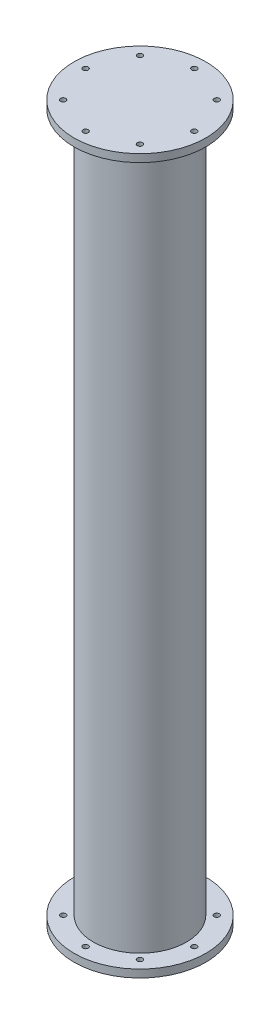
ISO-10303-21;
HEADER;
FILE_DESCRIPTION(('STEP AP214'),'2;1');
FILE_NAME('part.step','',(''),(''),'','','');
FILE_SCHEMA(('AUTOMOTIVE_DESIGN { 1 0 10303 214 1 1 1 1 }'));
ENDSEC;
DATA;
#1=APPLICATION_CONTEXT('core data for automotive mechanical design processes');
#2=APPLICATION_PROTOCOL_DEFINITION('international standard','automotive_design',2000,#1);
#3=PRODUCT_CONTEXT('',#1,'mechanical');
#4=PRODUCT('Part','Part','',(#3));
#5=PRODUCT_RELATED_PRODUCT_CATEGORY('part','',(#4));
#6=PRODUCT_DEFINITION_FORMATION('','',#4);
#7=PRODUCT_DEFINITION_CONTEXT('part definition',#1,'design');
#8=PRODUCT_DEFINITION('design','',#6,#7);
#9=PRODUCT_DEFINITION_SHAPE('','',#8);
#10=(LENGTH_UNIT() NAMED_UNIT(*) SI_UNIT(.MILLI.,.METRE.));
#11=(NAMED_UNIT(*) PLANE_ANGLE_UNIT() SI_UNIT($,.RADIAN.));
#12=(NAMED_UNIT(*) SI_UNIT($,.STERADIAN.) SOLID_ANGLE_UNIT());
#13=UNCERTAINTY_MEASURE_WITH_UNIT(LENGTH_MEASURE(1.E-05),#10,'distance_accuracy_value','');
#14=(GEOMETRIC_REPRESENTATION_CONTEXT(3) GLOBAL_UNCERTAINTY_ASSIGNED_CONTEXT((#13)) GLOBAL_UNIT_ASSIGNED_CONTEXT((#10,
#11,#12)) REPRESENTATION_CONTEXT('',''));
#15=CARTESIAN_POINT('',(0.,0.,0.));
#16=DIRECTION('',(0.,0.,1.));
#17=DIRECTION('',(1.,0.,0.));
#18=AXIS2_PLACEMENT_3D('',#15,#16,#17);
#19=CARTESIAN_POINT('',(0.,225.,0.));
#20=DIRECTION('',(0.,-1.,0.));
#21=DIRECTION('',(0.,0.,-1.));
#22=AXIS2_PLACEMENT_3D('',#19,#20,#21);
#23=CYLINDRICAL_SURFACE('',#22,30.);
#24=CARTESIAN_POINT('',(0.,225.,0.));
#25=DIRECTION('',(0.,1.,0.));
#26=DIRECTION('',(0.,0.,1.));
#27=AXIS2_PLACEMENT_3D('',#24,#25,#26);
#28=CIRCLE('',#27,30.);
#29=CARTESIAN_POINT('',(0.,225.,30.));
#30=VERTEX_POINT('',#29);
#31=EDGE_CURVE('E10',#30,#30,#28,.T.);
#32=ORIENTED_EDGE('',*,*,#31,.F.);
#33=EDGE_LOOP('',(#32));
#34=FACE_BOUND('',#33,.T.);
#35=CARTESIAN_POINT('',(0.,-225.,0.));
#36=DIRECTION('',(0.,1.,0.));
#37=DIRECTION('',(0.,0.,1.));
#38=AXIS2_PLACEMENT_3D('',#35,#36,#37);
#39=CIRCLE('',#38,30.);
#40=CARTESIAN_POINT('',(0.,-225.,30.));
#41=VERTEX_POINT('',#40);
#42=EDGE_CURVE('E35',#41,#41,#39,.T.);
#43=ORIENTED_EDGE('',*,*,#42,.T.);
#44=EDGE_LOOP('',(#43));
#45=FACE_BOUND('',#44,.T.);
#46=ADVANCED_FACE('F32',(#34,#45),#23,.T.);
#47=CARTESIAN_POINT('',(0.,230.,0.));
#48=DIRECTION('',(0.,-1.,0.));
#49=DIRECTION('',(0.,0.,-1.));
#50=AXIS2_PLACEMENT_3D('',#47,#48,#49);
#51=CYLINDRICAL_SURFACE('',#50,42.5);
#52=CARTESIAN_POINT('',(0.,230.,0.));
#53=DIRECTION('',(0.,1.,0.));
#54=DIRECTION('',(0.,0.,1.));
#55=AXIS2_PLACEMENT_3D('',#52,#53,#54);
#56=CIRCLE('',#55,42.5);
#57=CARTESIAN_POINT('',(0.,230.,42.5));
#58=VERTEX_POINT('',#57);
#59=EDGE_CURVE('E49',#58,#58,#56,.T.);
#60=ORIENTED_EDGE('',*,*,#59,.F.);
#61=EDGE_LOOP('',(#60));
#62=FACE_BOUND('',#61,.T.);
#63=CARTESIAN_POINT('',(0.,225.,0.));
#64=DIRECTION('',(0.,1.,0.));
#65=DIRECTION('',(0.,0.,1.));
#66=AXIS2_PLACEMENT_3D('',#63,#64,#65);
#67=CIRCLE('',#66,42.5);
#68=CARTESIAN_POINT('',(0.,225.,42.5));
#69=VERTEX_POINT('',#68);
#70=EDGE_CURVE('E50',#69,#69,#67,.T.);
#71=ORIENTED_EDGE('',*,*,#70,.T.);
#72=EDGE_LOOP('',(#71));
#73=FACE_BOUND('',#72,.T.);
#74=ADVANCED_FACE('F202',(#62,#73),#51,.T.);
#75=CARTESIAN_POINT('',(0.,230.,0.));
#76=DIRECTION('',(0.,1.,0.));
#77=DIRECTION('',(0.,0.,1.));
#78=AXIS2_PLACEMENT_3D('',#75,#76,#77);
#79=PLANE('',#78);
#80=CARTESIAN_POINT('',(24.7487373415292,230.,24.7487373415292));
#81=DIRECTION('',(0.,1.,0.));
#82=DIRECTION('',(0.,0.,1.));
#83=AXIS2_PLACEMENT_3D('',#80,#81,#82);
#84=CIRCLE('',#83,1.69999999999999);
#85=CARTESIAN_POINT('',(24.7487373415292,230.,26.4487373415292));
#86=VERTEX_POINT('',#85);
#87=EDGE_CURVE('E97',#86,#86,#84,.T.);
#88=ORIENTED_EDGE('',*,*,#87,.F.);
#89=EDGE_LOOP('',(#88));
#90=FACE_BOUND('',#89,.T.);
#91=CARTESIAN_POINT('',(35.,230.,0.));
#92=DIRECTION('',(0.,1.,0.));
#93=DIRECTION('',(0.,0.,1.));
#94=AXIS2_PLACEMENT_3D('',#91,#92,#93);
#95=CIRCLE('',#94,1.69999999999999);
#96=CARTESIAN_POINT('',(35.,230.,1.69999999999999));
#97=VERTEX_POINT('',#96);
#98=EDGE_CURVE('E91',#97,#97,#95,.T.);
#99=ORIENTED_EDGE('',*,*,#98,.F.);
#100=EDGE_LOOP('',(#99));
#101=FACE_BOUND('',#100,.T.);
#102=CARTESIAN_POINT('',(24.7487373415292,230.,-24.7487373415292));
#103=DIRECTION('',(0.,1.,0.));
#104=DIRECTION('',(0.,0.,1.));
#105=AXIS2_PLACEMENT_3D('',#102,#103,#104);
#106=CIRCLE('',#105,1.69999999999999);
#107=CARTESIAN_POINT('',(24.7487373415292,230.,-23.0487373415292));
#108=VERTEX_POINT('',#107);
#109=EDGE_CURVE('E85',#108,#108,#106,.T.);
#110=ORIENTED_EDGE('',*,*,#109,.F.);
#111=EDGE_LOOP('',(#110));
#112=FACE_BOUND('',#111,.T.);
#113=CARTESIAN_POINT('',(0.,230.,-35.));
#114=DIRECTION('',(0.,1.,0.));
#115=DIRECTION('',(0.,0.,1.));
#116=AXIS2_PLACEMENT_3D('',#113,#114,#115);
#117=CIRCLE('',#116,1.69999999999999);
#118=CARTESIAN_POINT('',(0.,230.,-33.3));
#119=VERTEX_POINT('',#118);
#120=EDGE_CURVE('E79',#119,#119,#117,.T.);
#121=ORIENTED_EDGE('',*,*,#120,.F.);
#122=EDGE_LOOP('',(#121));
#123=FACE_BOUND('',#122,.T.);
#124=CARTESIAN_POINT('',(-24.7487373415292,230.,-24.7487373415292));
#125=DIRECTION('',(0.,1.,0.));
#126=DIRECTION('',(0.,0.,1.));
#127=AXIS2_PLACEMENT_3D('',#124,#125,#126);
#128=CIRCLE('',#127,1.69999999999999);
#129=CARTESIAN_POINT('',(-24.7487373415292,230.,-23.0487373415292));
#130=VERTEX_POINT('',#129);
#131=EDGE_CURVE('E73',#130,#130,#128,.T.);
#132=ORIENTED_EDGE('',*,*,#131,.F.);
#133=EDGE_LOOP('',(#132));
#134=FACE_BOUND('',#133,.T.);
#135=CARTESIAN_POINT('',(-35.,230.,0.));
#136=DIRECTION('',(0.,1.,0.));
#137=DIRECTION('',(0.,0.,1.));
#138=AXIS2_PLACEMENT_3D('',#135,#136,#137);
#139=CIRCLE('',#138,1.69999999999999);
#140=CARTESIAN_POINT('',(-35.,230.,1.69999999999999));
#141=VERTEX_POINT('',#140);
#142=EDGE_CURVE('E67',#141,#141,#139,.T.);
#143=ORIENTED_EDGE('',*,*,#142,.F.);
#144=EDGE_LOOP('',(#143));
#145=FACE_BOUND('',#144,.T.);
#146=CARTESIAN_POINT('',(-24.7487373415292,230.,24.7487373415292));
#147=DIRECTION('',(0.,1.,0.));
#148=DIRECTION('',(0.,0.,1.));
#149=AXIS2_PLACEMENT_3D('',#146,#147,#148);
#150=CIRCLE('',#149,1.69999999999999);
#151=CARTESIAN_POINT('',(-24.7487373415292,230.,26.4487373415292));
#152=VERTEX_POINT('',#151);
#153=EDGE_CURVE('E61',#152,#152,#150,.T.);
#154=ORIENTED_EDGE('',*,*,#153,.F.);
#155=EDGE_LOOP('',(#154));
#156=FACE_BOUND('',#155,.T.);
#157=CARTESIAN_POINT('',(0.,230.,35.));
#158=DIRECTION('',(0.,1.,0.));
#159=DIRECTION('',(0.,0.,1.));
#160=AXIS2_PLACEMENT_3D('',#157,#158,#159);
#161=CIRCLE('',#160,1.69999999999999);
#162=CARTESIAN_POINT('',(0.,230.,36.7));
#163=VERTEX_POINT('',#162);
#164=EDGE_CURVE('E53',#163,#163,#161,.T.);
#165=ORIENTED_EDGE('',*,*,#164,.F.);
#166=EDGE_LOOP('',(#165));
#167=FACE_BOUND('',#166,.T.);
#168=ORIENTED_EDGE('',*,*,#59,.T.);
#169=EDGE_LOOP('',(#168));
#170=FACE_BOUND('',#169,.T.);
#171=ADVANCED_FACE('F207',(#90,#101,#112,#123,#134,#145,#156,#167,#170),#79,.T.);
#172=CARTESIAN_POINT('',(0.,225.,0.));
#173=DIRECTION('',(0.,1.,0.));
#174=DIRECTION('',(0.,0.,1.));
#175=AXIS2_PLACEMENT_3D('',#172,#173,#174);
#176=PLANE('',#175);
#177=CARTESIAN_POINT('',(24.7487373415292,225.,24.7487373415292));
#178=DIRECTION('',(0.,-1.,0.));
#179=DIRECTION('',(0.,0.,-1.));
#180=AXIS2_PLACEMENT_3D('',#177,#178,#179);
#181=CIRCLE('',#180,1.69999999999999);
#182=CARTESIAN_POINT('',(24.7487373415292,225.,23.0487373415292));
#183=VERTEX_POINT('',#182);
#184=EDGE_CURVE('E100',#183,#183,#181,.T.);
#185=ORIENTED_EDGE('',*,*,#184,.F.);
#186=EDGE_LOOP('',(#185));
#187=FACE_BOUND('',#186,.T.);
#188=CARTESIAN_POINT('',(35.,225.,0.));
#189=DIRECTION('',(0.,-1.,0.));
#190=DIRECTION('',(0.,0.,-1.));
#191=AXIS2_PLACEMENT_3D('',#188,#189,#190);
#192=CIRCLE('',#191,1.69999999999999);
#193=CARTESIAN_POINT('',(35.,225.,-1.69999999999998));
#194=VERTEX_POINT('',#193);
#195=EDGE_CURVE('E94',#194,#194,#192,.T.);
#196=ORIENTED_EDGE('',*,*,#195,.F.);
#197=EDGE_LOOP('',(#196));
#198=FACE_BOUND('',#197,.T.);
#199=CARTESIAN_POINT('',(24.7487373415292,225.,-24.7487373415292));
#200=DIRECTION('',(0.,-1.,0.));
#201=DIRECTION('',(0.,0.,-1.));
#202=AXIS2_PLACEMENT_3D('',#199,#200,#201);
#203=CIRCLE('',#202,1.69999999999999);
#204=CARTESIAN_POINT('',(24.7487373415292,225.,-26.4487373415292));
#205=VERTEX_POINT('',#204);
#206=EDGE_CURVE('E88',#205,#205,#203,.T.);
#207=ORIENTED_EDGE('',*,*,#206,.F.);
#208=EDGE_LOOP('',(#207));
#209=FACE_BOUND('',#208,.T.);
#210=CARTESIAN_POINT('',(0.,225.,-35.));
#211=DIRECTION('',(0.,-1.,0.));
#212=DIRECTION('',(0.,0.,-1.));
#213=AXIS2_PLACEMENT_3D('',#210,#211,#212);
#214=CIRCLE('',#213,1.69999999999999);
#215=CARTESIAN_POINT('',(0.,225.,-36.7));
#216=VERTEX_POINT('',#215);
#217=EDGE_CURVE('E82',#216,#216,#214,.T.);
#218=ORIENTED_EDGE('',*,*,#217,.F.);
#219=EDGE_LOOP('',(#218));
#220=FACE_BOUND('',#219,.T.);
#221=CARTESIAN_POINT('',(-24.7487373415292,225.,-24.7487373415292));
#222=DIRECTION('',(0.,-1.,0.));
#223=DIRECTION('',(0.,0.,-1.));
#224=AXIS2_PLACEMENT_3D('',#221,#222,#223);
#225=CIRCLE('',#224,1.69999999999999);
#226=CARTESIAN_POINT('',(-24.7487373415292,225.,-26.4487373415292));
#227=VERTEX_POINT('',#226);
#228=EDGE_CURVE('E76',#227,#227,#225,.T.);
#229=ORIENTED_EDGE('',*,*,#228,.F.);
#230=EDGE_LOOP('',(#229));
#231=FACE_BOUND('',#230,.T.);
#232=CARTESIAN_POINT('',(-35.,225.,0.));
#233=DIRECTION('',(0.,-1.,0.));
#234=DIRECTION('',(0.,0.,-1.));
#235=AXIS2_PLACEMENT_3D('',#232,#233,#234);
#236=CIRCLE('',#235,1.69999999999999);
#237=CARTESIAN_POINT('',(-35.,225.,-1.69999999999999));
#238=VERTEX_POINT('',#237);
#239=EDGE_CURVE('E70',#238,#238,#236,.T.);
#240=ORIENTED_EDGE('',*,*,#239,.F.);
#241=EDGE_LOOP('',(#240));
#242=FACE_BOUND('',#241,.T.);
#243=CARTESIAN_POINT('',(-24.7487373415292,225.,24.7487373415292));
#244=DIRECTION('',(0.,-1.,0.));
#245=DIRECTION('',(0.,0.,-1.));
#246=AXIS2_PLACEMENT_3D('',#243,#244,#245);
#247=CIRCLE('',#246,1.69999999999999);
#248=CARTESIAN_POINT('',(-24.7487373415292,225.,23.0487373415292));
#249=VERTEX_POINT('',#248);
#250=EDGE_CURVE('E64',#249,#249,#247,.T.);
#251=ORIENTED_EDGE('',*,*,#250,.F.);
#252=EDGE_LOOP('',(#251));
#253=FACE_BOUND('',#252,.T.);
#254=CARTESIAN_POINT('',(0.,225.,35.));
#255=DIRECTION('',(0.,-1.,0.));
#256=DIRECTION('',(0.,0.,-1.));
#257=AXIS2_PLACEMENT_3D('',#254,#255,#256);
#258=CIRCLE('',#257,1.69999999999999);
#259=CARTESIAN_POINT('',(0.,225.,33.3));
#260=VERTEX_POINT('',#259);
#261=EDGE_CURVE('E58',#260,#260,#258,.T.);
#262=ORIENTED_EDGE('',*,*,#261,.F.);
#263=EDGE_LOOP('',(#262));
#264=FACE_BOUND('',#263,.T.);
#265=ORIENTED_EDGE('',*,*,#31,.T.);
#266=EDGE_LOOP('',(#265));
#267=FACE_BOUND('',#266,.T.);
#268=ORIENTED_EDGE('',*,*,#70,.F.);
#269=EDGE_LOOP('',(#268));
#270=FACE_BOUND('',#269,.T.);
#271=ADVANCED_FACE('F214',(#187,#198,#209,#220,#231,#242,#253,#264,#267,#270),#176,.F.);
#272=CARTESIAN_POINT('',(0.,225.,35.));
#273=DIRECTION('',(0.,-1.,0.));
#274=DIRECTION('',(0.,0.,-1.));
#275=AXIS2_PLACEMENT_3D('',#272,#273,#274);
#276=CYLINDRICAL_SURFACE('',#275,1.69999999999999);
#277=ORIENTED_EDGE('',*,*,#261,.T.);
#278=EDGE_LOOP('',(#277));
#279=FACE_BOUND('',#278,.T.);
#280=ORIENTED_EDGE('',*,*,#164,.T.);
#281=EDGE_LOOP('',(#280));
#282=FACE_BOUND('',#281,.T.);
#283=ADVANCED_FACE('F370',(#279,#282),#276,.F.);
#284=CARTESIAN_POINT('',(-24.7487373415292,225.,24.7487373415292));
#285=DIRECTION('',(0.,-1.,0.));
#286=DIRECTION('',(0.,0.,-1.));
#287=AXIS2_PLACEMENT_3D('',#284,#285,#286);
#288=CYLINDRICAL_SURFACE('',#287,1.69999999999999);
#289=ORIENTED_EDGE('',*,*,#250,.T.);
#290=EDGE_LOOP('',(#289));
#291=FACE_BOUND('',#290,.T.);
#292=ORIENTED_EDGE('',*,*,#153,.T.);
#293=EDGE_LOOP('',(#292));
#294=FACE_BOUND('',#293,.T.);
#295=ADVANCED_FACE('F360',(#291,#294),#288,.F.);
#296=CARTESIAN_POINT('',(-35.,225.,0.));
#297=DIRECTION('',(0.,-1.,0.));
#298=DIRECTION('',(0.,0.,-1.));
#299=AXIS2_PLACEMENT_3D('',#296,#297,#298);
#300=CYLINDRICAL_SURFACE('',#299,1.69999999999999);
#301=ORIENTED_EDGE('',*,*,#239,.T.);
#302=EDGE_LOOP('',(#301));
#303=FACE_BOUND('',#302,.T.);
#304=ORIENTED_EDGE('',*,*,#142,.T.);
#305=EDGE_LOOP('',(#304));
#306=FACE_BOUND('',#305,.T.);
#307=ADVANCED_FACE('F350',(#303,#306),#300,.F.);
#308=CARTESIAN_POINT('',(-24.7487373415292,225.,-24.7487373415292));
#309=DIRECTION('',(0.,-1.,0.));
#310=DIRECTION('',(0.,0.,-1.));
#311=AXIS2_PLACEMENT_3D('',#308,#309,#310);
#312=CYLINDRICAL_SURFACE('',#311,1.69999999999999);
#313=ORIENTED_EDGE('',*,*,#228,.T.);
#314=EDGE_LOOP('',(#313));
#315=FACE_BOUND('',#314,.T.);
#316=ORIENTED_EDGE('',*,*,#131,.T.);
#317=EDGE_LOOP('',(#316));
#318=FACE_BOUND('',#317,.T.);
#319=ADVANCED_FACE('F340',(#315,#318),#312,.F.);
#320=CARTESIAN_POINT('',(0.,225.,-35.));
#321=DIRECTION('',(0.,-1.,0.));
#322=DIRECTION('',(0.,0.,-1.));
#323=AXIS2_PLACEMENT_3D('',#320,#321,#322);
#324=CYLINDRICAL_SURFACE('',#323,1.69999999999999);
#325=ORIENTED_EDGE('',*,*,#217,.T.);
#326=EDGE_LOOP('',(#325));
#327=FACE_BOUND('',#326,.T.);
#328=ORIENTED_EDGE('',*,*,#120,.T.);
#329=EDGE_LOOP('',(#328));
#330=FACE_BOUND('',#329,.T.);
#331=ADVANCED_FACE('F330',(#327,#330),#324,.F.);
#332=CARTESIAN_POINT('',(24.7487373415292,225.,-24.7487373415292));
#333=DIRECTION('',(0.,-1.,0.));
#334=DIRECTION('',(0.,0.,-1.));
#335=AXIS2_PLACEMENT_3D('',#332,#333,#334);
#336=CYLINDRICAL_SURFACE('',#335,1.69999999999999);
#337=ORIENTED_EDGE('',*,*,#206,.T.);
#338=EDGE_LOOP('',(#337));
#339=FACE_BOUND('',#338,.T.);
#340=ORIENTED_EDGE('',*,*,#109,.T.);
#341=EDGE_LOOP('',(#340));
#342=FACE_BOUND('',#341,.T.);
#343=ADVANCED_FACE('F320',(#339,#342),#336,.F.);
#344=CARTESIAN_POINT('',(35.,225.,0.));
#345=DIRECTION('',(0.,-1.,0.));
#346=DIRECTION('',(0.,0.,-1.));
#347=AXIS2_PLACEMENT_3D('',#344,#345,#346);
#348=CYLINDRICAL_SURFACE('',#347,1.69999999999999);
#349=ORIENTED_EDGE('',*,*,#195,.T.);
#350=EDGE_LOOP('',(#349));
#351=FACE_BOUND('',#350,.T.);
#352=ORIENTED_EDGE('',*,*,#98,.T.);
#353=EDGE_LOOP('',(#352));
#354=FACE_BOUND('',#353,.T.);
#355=ADVANCED_FACE('F198',(#351,#354),#348,.F.);
#356=CARTESIAN_POINT('',(24.7487373415292,225.,24.7487373415292));
#357=DIRECTION('',(0.,-1.,0.));
#358=DIRECTION('',(0.,0.,-1.));
#359=AXIS2_PLACEMENT_3D('',#356,#357,#358);
#360=CYLINDRICAL_SURFACE('',#359,1.69999999999999);
#361=ORIENTED_EDGE('',*,*,#184,.T.);
#362=EDGE_LOOP('',(#361));
#363=FACE_BOUND('',#362,.T.);
#364=ORIENTED_EDGE('',*,*,#87,.T.);
#365=EDGE_LOOP('',(#364));
#366=FACE_BOUND('',#365,.T.);
#367=ADVANCED_FACE('F189',(#363,#366),#360,.F.);
#368=CARTESIAN_POINT('',(0.,-230.,0.));
#369=DIRECTION('',(0.,1.,0.));
#370=DIRECTION('',(0.,0.,1.));
#371=AXIS2_PLACEMENT_3D('',#368,#369,#370);
#372=CYLINDRICAL_SURFACE('',#371,42.5);
#373=CARTESIAN_POINT('',(0.,-230.,0.));
#374=DIRECTION('',(0.,1.,0.));
#375=DIRECTION('',(0.,0.,1.));
#376=AXIS2_PLACEMENT_3D('',#373,#374,#375);
#377=CIRCLE('',#376,42.5);
#378=CARTESIAN_POINT('',(0.,-230.,42.5));
#379=VERTEX_POINT('',#378);
#380=EDGE_CURVE('E106',#379,#379,#377,.T.);
#381=ORIENTED_EDGE('',*,*,#380,.T.);
#382=EDGE_LOOP('',(#381));
#383=FACE_BOUND('',#382,.T.);
#384=CARTESIAN_POINT('',(0.,-225.,0.));
#385=DIRECTION('',(0.,1.,0.));
#386=DIRECTION('',(0.,0.,1.));
#387=AXIS2_PLACEMENT_3D('',#384,#385,#386);
#388=CIRCLE('',#387,42.5);
#389=CARTESIAN_POINT('',(0.,-225.,42.5));
#390=VERTEX_POINT('',#389);
#391=EDGE_CURVE('E103',#390,#390,#388,.T.);
#392=ORIENTED_EDGE('',*,*,#391,.F.);
#393=EDGE_LOOP('',(#392));
#394=FACE_BOUND('',#393,.T.);
#395=ADVANCED_FACE('F187',(#383,#394),#372,.T.);
#396=CARTESIAN_POINT('',(0.,-230.,0.));
#397=DIRECTION('',(0.,-1.,0.));
#398=DIRECTION('',(0.,0.,1.));
#399=AXIS2_PLACEMENT_3D('',#396,#397,#398);
#400=PLANE('',#399);
#401=CARTESIAN_POINT('',(24.7487373415292,-230.,24.7487373415292));
#402=DIRECTION('',(0.,-1.,0.));
#403=DIRECTION('',(0.,0.,-1.));
#404=AXIS2_PLACEMENT_3D('',#401,#402,#403);
#405=CIRCLE('',#404,1.69999999999999);
#406=CARTESIAN_POINT('',(24.7487373415292,-230.,23.0487373415292));
#407=VERTEX_POINT('',#406);
#408=EDGE_CURVE('E151',#407,#407,#405,.T.);
#409=ORIENTED_EDGE('',*,*,#408,.F.);
#410=EDGE_LOOP('',(#409));
#411=FACE_BOUND('',#410,.T.);
#412=CARTESIAN_POINT('',(35.,-230.,0.));
#413=DIRECTION('',(0.,-1.,0.));
#414=DIRECTION('',(0.,0.,-1.));
#415=AXIS2_PLACEMENT_3D('',#412,#413,#414);
#416=CIRCLE('',#415,1.69999999999999);
#417=CARTESIAN_POINT('',(35.,-230.,-1.69999999999999));
#418=VERTEX_POINT('',#417);
#419=EDGE_CURVE('E145',#418,#418,#416,.T.);
#420=ORIENTED_EDGE('',*,*,#419,.F.);
#421=EDGE_LOOP('',(#420));
#422=FACE_BOUND('',#421,.T.);
#423=CARTESIAN_POINT('',(24.7487373415292,-230.,-24.7487373415292));
#424=DIRECTION('',(0.,-1.,0.));
#425=DIRECTION('',(0.,0.,-1.));
#426=AXIS2_PLACEMENT_3D('',#423,#424,#425);
#427=CIRCLE('',#426,1.69999999999999);
#428=CARTESIAN_POINT('',(24.7487373415292,-230.,-26.4487373415292));
#429=VERTEX_POINT('',#428);
#430=EDGE_CURVE('E139',#429,#429,#427,.T.);
#431=ORIENTED_EDGE('',*,*,#430,.F.);
#432=EDGE_LOOP('',(#431));
#433=FACE_BOUND('',#432,.T.);
#434=CARTESIAN_POINT('',(0.,-230.,-35.));
#435=DIRECTION('',(0.,-1.,0.));
#436=DIRECTION('',(0.,0.,-1.));
#437=AXIS2_PLACEMENT_3D('',#434,#435,#436);
#438=CIRCLE('',#437,1.69999999999999);
#439=CARTESIAN_POINT('',(0.,-230.,-36.7));
#440=VERTEX_POINT('',#439);
#441=EDGE_CURVE('E133',#440,#440,#438,.T.);
#442=ORIENTED_EDGE('',*,*,#441,.F.);
#443=EDGE_LOOP('',(#442));
#444=FACE_BOUND('',#443,.T.);
#445=CARTESIAN_POINT('',(-24.7487373415292,-230.,-24.7487373415292));
#446=DIRECTION('',(0.,-1.,0.));
#447=DIRECTION('',(0.,0.,-1.));
#448=AXIS2_PLACEMENT_3D('',#445,#446,#447);
#449=CIRCLE('',#448,1.69999999999999);
#450=CARTESIAN_POINT('',(-24.7487373415292,-230.,-26.4487373415292));
#451=VERTEX_POINT('',#450);
#452=EDGE_CURVE('E127',#451,#451,#449,.T.);
#453=ORIENTED_EDGE('',*,*,#452,.F.);
#454=EDGE_LOOP('',(#453));
#455=FACE_BOUND('',#454,.T.);
#456=CARTESIAN_POINT('',(-35.,-230.,0.));
#457=DIRECTION('',(0.,-1.,0.));
#458=DIRECTION('',(0.,0.,-1.));
#459=AXIS2_PLACEMENT_3D('',#456,#457,#458);
#460=CIRCLE('',#459,1.69999999999999);
#461=CARTESIAN_POINT('',(-35.,-230.,-1.69999999999999));
#462=VERTEX_POINT('',#461);
#463=EDGE_CURVE('E121',#462,#462,#460,.T.);
#464=ORIENTED_EDGE('',*,*,#463,.F.);
#465=EDGE_LOOP('',(#464));
#466=FACE_BOUND('',#465,.T.);
#467=CARTESIAN_POINT('',(-24.7487373415292,-230.,24.7487373415292));
#468=DIRECTION('',(0.,-1.,0.));
#469=DIRECTION('',(0.,0.,-1.));
#470=AXIS2_PLACEMENT_3D('',#467,#468,#469);
#471=CIRCLE('',#470,1.69999999999999);
#472=CARTESIAN_POINT('',(-24.7487373415292,-230.,23.0487373415292));
#473=VERTEX_POINT('',#472);
#474=EDGE_CURVE('E115',#473,#473,#471,.T.);
#475=ORIENTED_EDGE('',*,*,#474,.F.);
#476=EDGE_LOOP('',(#475));
#477=FACE_BOUND('',#476,.T.);
#478=CARTESIAN_POINT('',(0.,-230.,35.));
#479=DIRECTION('',(0.,-1.,0.));
#480=DIRECTION('',(0.,0.,-1.));
#481=AXIS2_PLACEMENT_3D('',#478,#479,#480);
#482=CIRCLE('',#481,1.69999999999999);
#483=CARTESIAN_POINT('',(0.,-230.,33.3));
#484=VERTEX_POINT('',#483);
#485=EDGE_CURVE('E107',#484,#484,#482,.T.);
#486=ORIENTED_EDGE('',*,*,#485,.F.);
#487=EDGE_LOOP('',(#486));
#488=FACE_BOUND('',#487,.T.);
#489=ORIENTED_EDGE('',*,*,#380,.F.);
#490=EDGE_LOOP('',(#489));
#491=FACE_BOUND('',#490,.T.);
#492=ADVANCED_FACE('F165',(#411,#422,#433,#444,#455,#466,#477,#488,#491),#400,.T.);
#493=CARTESIAN_POINT('',(0.,-225.,0.));
#494=DIRECTION('',(0.,-1.,0.));
#495=DIRECTION('',(0.,0.,1.));
#496=AXIS2_PLACEMENT_3D('',#493,#494,#495);
#497=PLANE('',#496);
#498=CARTESIAN_POINT('',(24.7487373415292,-225.,24.7487373415292));
#499=DIRECTION('',(0.,1.,0.));
#500=DIRECTION('',(0.,0.,1.));
#501=AXIS2_PLACEMENT_3D('',#498,#499,#500);
#502=CIRCLE('',#501,1.69999999999999);
#503=CARTESIAN_POINT('',(24.7487373415292,-225.,26.4487373415292));
#504=VERTEX_POINT('',#503);
#505=EDGE_CURVE('E154',#504,#504,#502,.T.);
#506=ORIENTED_EDGE('',*,*,#505,.F.);
#507=EDGE_LOOP('',(#506));
#508=FACE_BOUND('',#507,.T.);
#509=CARTESIAN_POINT('',(35.,-225.,0.));
#510=DIRECTION('',(0.,1.,0.));
#511=DIRECTION('',(0.,0.,1.));
#512=AXIS2_PLACEMENT_3D('',#509,#510,#511);
#513=CIRCLE('',#512,1.69999999999999);
#514=CARTESIAN_POINT('',(35.,-225.,1.69999999999999));
#515=VERTEX_POINT('',#514);
#516=EDGE_CURVE('E148',#515,#515,#513,.T.);
#517=ORIENTED_EDGE('',*,*,#516,.F.);
#518=EDGE_LOOP('',(#517));
#519=FACE_BOUND('',#518,.T.);
#520=CARTESIAN_POINT('',(24.7487373415292,-225.,-24.7487373415292));
#521=DIRECTION('',(0.,1.,0.));
#522=DIRECTION('',(0.,0.,1.));
#523=AXIS2_PLACEMENT_3D('',#520,#521,#522);
#524=CIRCLE('',#523,1.69999999999999);
#525=CARTESIAN_POINT('',(24.7487373415292,-225.,-23.0487373415292));
#526=VERTEX_POINT('',#525);
#527=EDGE_CURVE('E142',#526,#526,#524,.T.);
#528=ORIENTED_EDGE('',*,*,#527,.F.);
#529=EDGE_LOOP('',(#528));
#530=FACE_BOUND('',#529,.T.);
#531=CARTESIAN_POINT('',(0.,-225.,-35.));
#532=DIRECTION('',(0.,1.,0.));
#533=DIRECTION('',(0.,0.,1.));
#534=AXIS2_PLACEMENT_3D('',#531,#532,#533);
#535=CIRCLE('',#534,1.69999999999999);
#536=CARTESIAN_POINT('',(0.,-225.,-33.3));
#537=VERTEX_POINT('',#536);
#538=EDGE_CURVE('E136',#537,#537,#535,.T.);
#539=ORIENTED_EDGE('',*,*,#538,.F.);
#540=EDGE_LOOP('',(#539));
#541=FACE_BOUND('',#540,.T.);
#542=CARTESIAN_POINT('',(-24.7487373415292,-225.,-24.7487373415292));
#543=DIRECTION('',(0.,1.,0.));
#544=DIRECTION('',(0.,0.,1.));
#545=AXIS2_PLACEMENT_3D('',#542,#543,#544);
#546=CIRCLE('',#545,1.69999999999999);
#547=CARTESIAN_POINT('',(-24.7487373415292,-225.,-23.0487373415292));
#548=VERTEX_POINT('',#547);
#549=EDGE_CURVE('E130',#548,#548,#546,.T.);
#550=ORIENTED_EDGE('',*,*,#549,.F.);
#551=EDGE_LOOP('',(#550));
#552=FACE_BOUND('',#551,.T.);
#553=CARTESIAN_POINT('',(-35.,-225.,0.));
#554=DIRECTION('',(0.,1.,0.));
#555=DIRECTION('',(0.,0.,1.));
#556=AXIS2_PLACEMENT_3D('',#553,#554,#555);
#557=CIRCLE('',#556,1.69999999999999);
#558=CARTESIAN_POINT('',(-35.,-225.,1.69999999999999));
#559=VERTEX_POINT('',#558);
#560=EDGE_CURVE('E124',#559,#559,#557,.T.);
#561=ORIENTED_EDGE('',*,*,#560,.F.);
#562=EDGE_LOOP('',(#561));
#563=FACE_BOUND('',#562,.T.);
#564=CARTESIAN_POINT('',(-24.7487373415292,-225.,24.7487373415292));
#565=DIRECTION('',(0.,1.,0.));
#566=DIRECTION('',(0.,0.,1.));
#567=AXIS2_PLACEMENT_3D('',#564,#565,#566);
#568=CIRCLE('',#567,1.69999999999999);
#569=CARTESIAN_POINT('',(-24.7487373415292,-225.,26.4487373415292));
#570=VERTEX_POINT('',#569);
#571=EDGE_CURVE('E118',#570,#570,#568,.T.);
#572=ORIENTED_EDGE('',*,*,#571,.F.);
#573=EDGE_LOOP('',(#572));
#574=FACE_BOUND('',#573,.T.);
#575=CARTESIAN_POINT('',(0.,-225.,35.));
#576=DIRECTION('',(0.,1.,0.));
#577=DIRECTION('',(0.,0.,1.));
#578=AXIS2_PLACEMENT_3D('',#575,#576,#577);
#579=CIRCLE('',#578,1.69999999999999);
#580=CARTESIAN_POINT('',(0.,-225.,36.7));
#581=VERTEX_POINT('',#580);
#582=EDGE_CURVE('E112',#581,#581,#579,.T.);
#583=ORIENTED_EDGE('',*,*,#582,.F.);
#584=EDGE_LOOP('',(#583));
#585=FACE_BOUND('',#584,.T.);
#586=ORIENTED_EDGE('',*,*,#42,.F.);
#587=EDGE_LOOP('',(#586));
#588=FACE_BOUND('',#587,.T.);
#589=ORIENTED_EDGE('',*,*,#391,.T.);
#590=EDGE_LOOP('',(#589));
#591=FACE_BOUND('',#590,.T.);
#592=ADVANCED_FACE('F161',(#508,#519,#530,#541,#552,#563,#574,#585,#588,#591),#497,.F.);
#593=CARTESIAN_POINT('',(0.,-225.,35.));
#594=DIRECTION('',(0.,1.,0.));
#595=DIRECTION('',(0.,0.,1.));
#596=AXIS2_PLACEMENT_3D('',#593,#594,#595);
#597=CYLINDRICAL_SURFACE('',#596,1.69999999999999);
#598=ORIENTED_EDGE('',*,*,#582,.T.);
#599=EDGE_LOOP('',(#598));
#600=FACE_BOUND('',#599,.T.);
#601=ORIENTED_EDGE('',*,*,#485,.T.);
#602=EDGE_LOOP('',(#601));
#603=FACE_BOUND('',#602,.T.);
#604=ADVANCED_FACE('F164',(#600,#603),#597,.F.);
#605=CARTESIAN_POINT('',(-24.7487373415292,-225.,24.7487373415292));
#606=DIRECTION('',(0.,1.,0.));
#607=DIRECTION('',(0.,0.,1.));
#608=AXIS2_PLACEMENT_3D('',#605,#606,#607);
#609=CYLINDRICAL_SURFACE('',#608,1.69999999999999);
#610=ORIENTED_EDGE('',*,*,#571,.T.);
#611=EDGE_LOOP('',(#610));
#612=FACE_BOUND('',#611,.T.);
#613=ORIENTED_EDGE('',*,*,#474,.T.);
#614=EDGE_LOOP('',(#613));
#615=FACE_BOUND('',#614,.T.);
#616=ADVANCED_FACE('F238',(#612,#615),#609,.F.);
#617=CARTESIAN_POINT('',(-35.,-225.,0.));
#618=DIRECTION('',(0.,1.,0.));
#619=DIRECTION('',(0.,0.,1.));
#620=AXIS2_PLACEMENT_3D('',#617,#618,#619);
#621=CYLINDRICAL_SURFACE('',#620,1.69999999999999);
#622=ORIENTED_EDGE('',*,*,#560,.T.);
#623=EDGE_LOOP('',(#622));
#624=FACE_BOUND('',#623,.T.);
#625=ORIENTED_EDGE('',*,*,#463,.T.);
#626=EDGE_LOOP('',(#625));
#627=FACE_BOUND('',#626,.T.);
#628=ADVANCED_FACE('F242',(#624,#627),#621,.F.);
#629=CARTESIAN_POINT('',(-24.7487373415292,-225.,-24.7487373415292));
#630=DIRECTION('',(0.,1.,0.));
#631=DIRECTION('',(0.,0.,1.));
#632=AXIS2_PLACEMENT_3D('',#629,#630,#631);
#633=CYLINDRICAL_SURFACE('',#632,1.69999999999999);
#634=ORIENTED_EDGE('',*,*,#549,.T.);
#635=EDGE_LOOP('',(#634));
#636=FACE_BOUND('',#635,.T.);
#637=ORIENTED_EDGE('',*,*,#452,.T.);
#638=EDGE_LOOP('',(#637));
#639=FACE_BOUND('',#638,.T.);
#640=ADVANCED_FACE('F246',(#636,#639),#633,.F.);
#641=CARTESIAN_POINT('',(0.,-225.,-35.));
#642=DIRECTION('',(0.,1.,0.));
#643=DIRECTION('',(0.,0.,1.));
#644=AXIS2_PLACEMENT_3D('',#641,#642,#643);
#645=CYLINDRICAL_SURFACE('',#644,1.69999999999999);
#646=ORIENTED_EDGE('',*,*,#538,.T.);
#647=EDGE_LOOP('',(#646));
#648=FACE_BOUND('',#647,.T.);
#649=ORIENTED_EDGE('',*,*,#441,.T.);
#650=EDGE_LOOP('',(#649));
#651=FACE_BOUND('',#650,.T.);
#652=ADVANCED_FACE('F250',(#648,#651),#645,.F.);
#653=CARTESIAN_POINT('',(24.7487373415292,-225.,-24.7487373415292));
#654=DIRECTION('',(0.,1.,0.));
#655=DIRECTION('',(0.,0.,1.));
#656=AXIS2_PLACEMENT_3D('',#653,#654,#655);
#657=CYLINDRICAL_SURFACE('',#656,1.69999999999999);
#658=ORIENTED_EDGE('',*,*,#527,.T.);
#659=EDGE_LOOP('',(#658));
#660=FACE_BOUND('',#659,.T.);
#661=ORIENTED_EDGE('',*,*,#430,.T.);
#662=EDGE_LOOP('',(#661));
#663=FACE_BOUND('',#662,.T.);
#664=ADVANCED_FACE('F254',(#660,#663),#657,.F.);
#665=CARTESIAN_POINT('',(35.,-225.,0.));
#666=DIRECTION('',(0.,1.,0.));
#667=DIRECTION('',(0.,0.,1.));
#668=AXIS2_PLACEMENT_3D('',#665,#666,#667);
#669=CYLINDRICAL_SURFACE('',#668,1.69999999999999);
#670=ORIENTED_EDGE('',*,*,#516,.T.);
#671=EDGE_LOOP('',(#670));
#672=FACE_BOUND('',#671,.T.);
#673=ORIENTED_EDGE('',*,*,#419,.T.);
#674=EDGE_LOOP('',(#673));
#675=FACE_BOUND('',#674,.T.);
#676=ADVANCED_FACE('F258',(#672,#675),#669,.F.);
#677=CARTESIAN_POINT('',(24.7487373415292,-225.,24.7487373415292));
#678=DIRECTION('',(0.,1.,0.));
#679=DIRECTION('',(0.,0.,1.));
#680=AXIS2_PLACEMENT_3D('',#677,#678,#679);
#681=CYLINDRICAL_SURFACE('',#680,1.69999999999999);
#682=ORIENTED_EDGE('',*,*,#505,.T.);
#683=EDGE_LOOP('',(#682));
#684=FACE_BOUND('',#683,.T.);
#685=ORIENTED_EDGE('',*,*,#408,.T.);
#686=EDGE_LOOP('',(#685));
#687=FACE_BOUND('',#686,.T.);
#688=ADVANCED_FACE('F158',(#684,#687),#681,.F.);
#689=CLOSED_SHELL('',(#46,#74,#171,#271,#283,#295,#307,#319,#331,#343,#355,#367,#395,#492,#592,
#604,#616,#628,#640,#652,#664,#676,#688));
#690=CARTESIAN_POINT('',(0.,-225.,0.));
#691=DIRECTION('',(0.,1.,0.));
#692=DIRECTION('',(0.,0.,1.));
#693=AXIS2_PLACEMENT_3D('',#690,#691,#692);
#694=CIRCLE('',#693,25.);
#695=CARTESIAN_POINT('',(0.,-225.,25.));
#696=VERTEX_POINT('',#695);
#697=EDGE_CURVE('E40',#696,#696,#694,.T.);
#698=ORIENTED_EDGE('',*,*,#697,.T.);
#699=EDGE_LOOP('',(#698));
#700=FACE_BOUND('',#699,.T.);
#701=ADVANCED_FACE('F167',(#700),#497,.F.);
#702=CARTESIAN_POINT('',(0.,225.,0.));
#703=DIRECTION('',(0.,1.,0.));
#704=DIRECTION('',(0.,0.,1.));
#705=AXIS2_PLACEMENT_3D('',#702,#703,#704);
#706=CIRCLE('',#705,25.);
#707=CARTESIAN_POINT('',(0.,225.,25.));
#708=VERTEX_POINT('',#707);
#709=EDGE_CURVE('E44',#708,#708,#706,.T.);
#710=ORIENTED_EDGE('',*,*,#709,.F.);
#711=EDGE_LOOP('',(#710));
#712=FACE_BOUND('',#711,.T.);
#713=ADVANCED_FACE('F222',(#712),#176,.F.);
#714=CARTESIAN_POINT('',(0.,225.,0.));
#715=DIRECTION('',(0.,-1.,0.));
#716=DIRECTION('',(0.,0.,-1.));
#717=AXIS2_PLACEMENT_3D('',#714,#715,#716);
#718=CYLINDRICAL_SURFACE('',#717,25.);
#719=ORIENTED_EDGE('',*,*,#709,.T.);
#720=EDGE_LOOP('',(#719));
#721=FACE_BOUND('',#720,.T.);
#722=ORIENTED_EDGE('',*,*,#697,.F.);
#723=EDGE_LOOP('',(#722));
#724=FACE_BOUND('',#723,.T.);
#725=ADVANCED_FACE('F220',(#721,#724),#718,.F.);
#726=CLOSED_SHELL('',(#701,#713,#725));
#727=ORIENTED_CLOSED_SHELL('',*,#726,.T.);
#728=BREP_WITH_VOIDS('B2',#689,(#727));
#729=ADVANCED_BREP_SHAPE_REPRESENTATION('',(#18,#728),#14);
#730=SHAPE_DEFINITION_REPRESENTATION(#9,#729);
ENDSEC;
END-ISO-10303-21;
